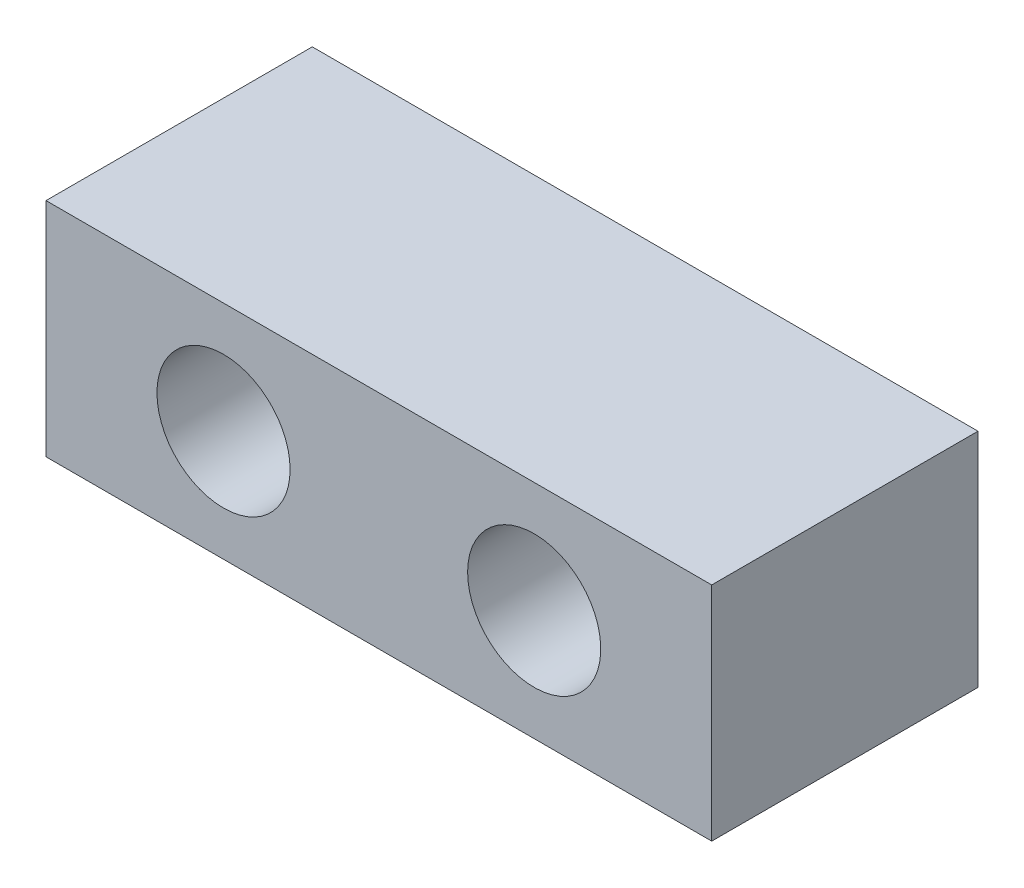
ISO-10303-21;
HEADER;
FILE_DESCRIPTION(('STEP AP214'),'2;1');
FILE_NAME('part.step','',(''),(''),'','','');
FILE_SCHEMA(('AUTOMOTIVE_DESIGN { 1 0 10303 214 1 1 1 1 }'));
ENDSEC;
DATA;
#1=APPLICATION_CONTEXT('core data for automotive mechanical design processes');
#2=APPLICATION_PROTOCOL_DEFINITION('international standard','automotive_design',2000,#1);
#3=PRODUCT_CONTEXT('',#1,'mechanical');
#4=PRODUCT('Part','Part','',(#3));
#5=PRODUCT_RELATED_PRODUCT_CATEGORY('part','',(#4));
#6=PRODUCT_DEFINITION_FORMATION('','',#4);
#7=PRODUCT_DEFINITION_CONTEXT('part definition',#1,'design');
#8=PRODUCT_DEFINITION('design','',#6,#7);
#9=PRODUCT_DEFINITION_SHAPE('','',#8);
#10=(LENGTH_UNIT() NAMED_UNIT(*) SI_UNIT(.MILLI.,.METRE.));
#11=(NAMED_UNIT(*) PLANE_ANGLE_UNIT() SI_UNIT($,.RADIAN.));
#12=(NAMED_UNIT(*) SI_UNIT($,.STERADIAN.) SOLID_ANGLE_UNIT());
#13=UNCERTAINTY_MEASURE_WITH_UNIT(LENGTH_MEASURE(1.E-05),#10,'distance_accuracy_value','');
#14=(GEOMETRIC_REPRESENTATION_CONTEXT(3) GLOBAL_UNCERTAINTY_ASSIGNED_CONTEXT((#13)) GLOBAL_UNIT_ASSIGNED_CONTEXT((#10,
#11,#12)) REPRESENTATION_CONTEXT('',''));
#15=CARTESIAN_POINT('',(0.,0.,0.));
#16=DIRECTION('',(0.,0.,1.));
#17=DIRECTION('',(1.,0.,0.));
#18=AXIS2_PLACEMENT_3D('',#15,#16,#17);
#19=CARTESIAN_POINT('',(0.,0.,12.));
#20=DIRECTION('',(1.,0.,0.));
#21=DIRECTION('',(0.,0.,-1.));
#22=AXIS2_PLACEMENT_3D('',#19,#20,#21);
#23=PLANE('',#22);
#24=DIRECTION('',(0.,-1.,0.));
#25=VECTOR('',#24,1.);
#26=CARTESIAN_POINT('',(0.,0.,0.));
#27=LINE('',#26,#25);
#28=CARTESIAN_POINT('',(0.,10.,0.));
#29=VERTEX_POINT('',#28);
#30=CARTESIAN_POINT('',(0.,0.,0.));
#31=VERTEX_POINT('',#30);
#32=EDGE_CURVE('E96',#29,#31,#27,.T.);
#33=ORIENTED_EDGE('',*,*,#32,.T.);
#34=DIRECTION('',(0.,0.,-1.));
#35=VECTOR('',#34,1.);
#36=CARTESIAN_POINT('',(0.,0.,12.));
#37=LINE('',#36,#35);
#38=CARTESIAN_POINT('',(0.,0.,12.));
#39=VERTEX_POINT('',#38);
#40=EDGE_CURVE('E11',#39,#31,#37,.T.);
#41=ORIENTED_EDGE('',*,*,#40,.F.);
#42=DIRECTION('',(0.,-1.,0.));
#43=VECTOR('',#42,1.);
#44=CARTESIAN_POINT('',(0.,0.,12.));
#45=LINE('',#44,#43);
#46=CARTESIAN_POINT('',(0.,10.,12.));
#47=VERTEX_POINT('',#46);
#48=EDGE_CURVE('E84',#47,#39,#45,.T.);
#49=ORIENTED_EDGE('',*,*,#48,.F.);
#50=DIRECTION('',(0.,0.,-1.));
#51=VECTOR('',#50,1.);
#52=CARTESIAN_POINT('',(0.,10.,12.));
#53=LINE('',#52,#51);
#54=EDGE_CURVE('E92',#47,#29,#53,.T.);
#55=ORIENTED_EDGE('',*,*,#54,.T.);
#56=EDGE_LOOP('',(#33,#41,#49,#55));
#57=FACE_BOUND('',#56,.T.);
#58=ADVANCED_FACE('F33',(#57),#23,.F.);
#59=CARTESIAN_POINT('',(0.,0.,12.));
#60=DIRECTION('',(0.,1.,0.));
#61=DIRECTION('',(0.,0.,1.));
#62=AXIS2_PLACEMENT_3D('',#59,#60,#61);
#63=PLANE('',#62);
#64=DIRECTION('',(1.,0.,0.));
#65=VECTOR('',#64,1.);
#66=CARTESIAN_POINT('',(0.,0.,0.));
#67=LINE('',#66,#65);
#68=CARTESIAN_POINT('',(30.,0.,0.));
#69=VERTEX_POINT('',#68);
#70=EDGE_CURVE('E88',#31,#69,#67,.T.);
#71=ORIENTED_EDGE('',*,*,#70,.T.);
#72=DIRECTION('',(0.,0.,-1.));
#73=VECTOR('',#72,1.);
#74=CARTESIAN_POINT('',(30.,0.,12.));
#75=LINE('',#74,#73);
#76=CARTESIAN_POINT('',(30.,0.,12.));
#77=VERTEX_POINT('',#76);
#78=EDGE_CURVE('E41',#77,#69,#75,.T.);
#79=ORIENTED_EDGE('',*,*,#78,.F.);
#80=DIRECTION('',(1.,0.,0.));
#81=VECTOR('',#80,1.);
#82=CARTESIAN_POINT('',(0.,0.,12.));
#83=LINE('',#82,#81);
#84=EDGE_CURVE('E79',#39,#77,#83,.T.);
#85=ORIENTED_EDGE('',*,*,#84,.F.);
#86=ORIENTED_EDGE('',*,*,#40,.T.);
#87=EDGE_LOOP('',(#71,#79,#85,#86));
#88=FACE_BOUND('',#87,.T.);
#89=ADVANCED_FACE('F87',(#88),#63,.F.);
#90=CARTESIAN_POINT('',(30.,0.,12.));
#91=DIRECTION('',(-1.,0.,0.));
#92=DIRECTION('',(0.,0.,1.));
#93=AXIS2_PLACEMENT_3D('',#90,#91,#92);
#94=PLANE('',#93);
#95=DIRECTION('',(0.,1.,0.));
#96=VECTOR('',#95,1.);
#97=CARTESIAN_POINT('',(30.,0.,0.));
#98=LINE('',#97,#96);
#99=CARTESIAN_POINT('',(30.,10.,0.));
#100=VERTEX_POINT('',#99);
#101=EDGE_CURVE('E66',#69,#100,#98,.T.);
#102=ORIENTED_EDGE('',*,*,#101,.T.);
#103=DIRECTION('',(0.,0.,-1.));
#104=VECTOR('',#103,1.);
#105=CARTESIAN_POINT('',(30.,10.,12.));
#106=LINE('',#105,#104);
#107=CARTESIAN_POINT('',(30.,10.,12.));
#108=VERTEX_POINT('',#107);
#109=EDGE_CURVE('E89',#108,#100,#106,.T.);
#110=ORIENTED_EDGE('',*,*,#109,.F.);
#111=DIRECTION('',(0.,1.,0.));
#112=VECTOR('',#111,1.);
#113=CARTESIAN_POINT('',(30.,0.,12.));
#114=LINE('',#113,#112);
#115=EDGE_CURVE('E82',#77,#108,#114,.T.);
#116=ORIENTED_EDGE('',*,*,#115,.F.);
#117=ORIENTED_EDGE('',*,*,#78,.T.);
#118=EDGE_LOOP('',(#102,#110,#116,#117));
#119=FACE_BOUND('',#118,.T.);
#120=ADVANCED_FACE('F90',(#119),#94,.F.);
#121=CARTESIAN_POINT('',(0.,10.,12.));
#122=DIRECTION('',(0.,-1.,0.));
#123=DIRECTION('',(0.,0.,-1.));
#124=AXIS2_PLACEMENT_3D('',#121,#122,#123);
#125=PLANE('',#124);
#126=DIRECTION('',(-1.,0.,0.));
#127=VECTOR('',#126,1.);
#128=CARTESIAN_POINT('',(0.,10.,0.));
#129=LINE('',#128,#127);
#130=EDGE_CURVE('E72',#100,#29,#129,.T.);
#131=ORIENTED_EDGE('',*,*,#130,.T.);
#132=ORIENTED_EDGE('',*,*,#54,.F.);
#133=DIRECTION('',(-1.,0.,0.));
#134=VECTOR('',#133,1.);
#135=CARTESIAN_POINT('',(0.,10.,12.));
#136=LINE('',#135,#134);
#137=EDGE_CURVE('E49',#108,#47,#136,.T.);
#138=ORIENTED_EDGE('',*,*,#137,.F.);
#139=ORIENTED_EDGE('',*,*,#109,.T.);
#140=EDGE_LOOP('',(#131,#132,#138,#139));
#141=FACE_BOUND('',#140,.T.);
#142=ADVANCED_FACE('F104',(#141),#125,.F.);
#143=CARTESIAN_POINT('',(0.,0.,12.));
#144=DIRECTION('',(0.,0.,-1.));
#145=DIRECTION('',(-1.,0.,0.));
#146=AXIS2_PLACEMENT_3D('',#143,#144,#145);
#147=PLANE('',#146);
#148=CARTESIAN_POINT('',(22.,5.,12.));
#149=DIRECTION('',(0.,0.,-1.));
#150=DIRECTION('',(-1.,0.,0.));
#151=AXIS2_PLACEMENT_3D('',#148,#149,#150);
#152=CIRCLE('',#151,3.);
#153=CARTESIAN_POINT('',(19.,5.,12.));
#154=VERTEX_POINT('',#153);
#155=EDGE_CURVE('E115',#154,#154,#152,.T.);
#156=ORIENTED_EDGE('',*,*,#155,.T.);
#157=EDGE_LOOP('',(#156));
#158=FACE_BOUND('',#157,.T.);
#159=CARTESIAN_POINT('',(8.,5.,12.));
#160=DIRECTION('',(0.,0.,-1.));
#161=DIRECTION('',(-1.,0.,0.));
#162=AXIS2_PLACEMENT_3D('',#159,#160,#161);
#163=CIRCLE('',#162,3.);
#164=CARTESIAN_POINT('',(5.,5.,12.));
#165=VERTEX_POINT('',#164);
#166=EDGE_CURVE('E99',#165,#165,#163,.T.);
#167=ORIENTED_EDGE('',*,*,#166,.T.);
#168=EDGE_LOOP('',(#167));
#169=FACE_BOUND('',#168,.T.);
#170=ORIENTED_EDGE('',*,*,#48,.T.);
#171=ORIENTED_EDGE('',*,*,#84,.T.);
#172=ORIENTED_EDGE('',*,*,#115,.T.);
#173=ORIENTED_EDGE('',*,*,#137,.T.);
#174=EDGE_LOOP('',(#170,#171,#172,#173));
#175=FACE_BOUND('',#174,.T.);
#176=ADVANCED_FACE('F80',(#158,#169,#175),#147,.F.);
#177=CARTESIAN_POINT('',(0.,0.,0.));
#178=DIRECTION('',(0.,0.,-1.));
#179=DIRECTION('',(-1.,0.,0.));
#180=AXIS2_PLACEMENT_3D('',#177,#178,#179);
#181=PLANE('',#180);
#182=CARTESIAN_POINT('',(22.,5.,0.));
#183=DIRECTION('',(0.,0.,1.));
#184=DIRECTION('',(-1.,0.,0.));
#185=AXIS2_PLACEMENT_3D('',#182,#183,#184);
#186=CIRCLE('',#185,3.);
#187=CARTESIAN_POINT('',(19.,5.,0.));
#188=VERTEX_POINT('',#187);
#189=EDGE_CURVE('E118',#188,#188,#186,.T.);
#190=ORIENTED_EDGE('',*,*,#189,.T.);
#191=EDGE_LOOP('',(#190));
#192=FACE_BOUND('',#191,.T.);
#193=CARTESIAN_POINT('',(8.,5.,0.));
#194=DIRECTION('',(0.,0.,1.));
#195=DIRECTION('',(1.,0.,0.));
#196=AXIS2_PLACEMENT_3D('',#193,#194,#195);
#197=CIRCLE('',#196,3.);
#198=CARTESIAN_POINT('',(11.,5.,0.));
#199=VERTEX_POINT('',#198);
#200=EDGE_CURVE('E112',#199,#199,#197,.T.);
#201=ORIENTED_EDGE('',*,*,#200,.T.);
#202=EDGE_LOOP('',(#201));
#203=FACE_BOUND('',#202,.T.);
#204=ORIENTED_EDGE('',*,*,#32,.F.);
#205=ORIENTED_EDGE('',*,*,#130,.F.);
#206=ORIENTED_EDGE('',*,*,#101,.F.);
#207=ORIENTED_EDGE('',*,*,#70,.F.);
#208=EDGE_LOOP('',(#204,#205,#206,#207));
#209=FACE_BOUND('',#208,.T.);
#210=ADVANCED_FACE('F107',(#192,#203,#209),#181,.T.);
#211=CARTESIAN_POINT('',(8.,5.,0.));
#212=DIRECTION('',(0.,0.,1.));
#213=DIRECTION('',(1.,0.,0.));
#214=AXIS2_PLACEMENT_3D('',#211,#212,#213);
#215=CYLINDRICAL_SURFACE('',#214,3.);
#216=ORIENTED_EDGE('',*,*,#200,.F.);
#217=EDGE_LOOP('',(#216));
#218=FACE_BOUND('',#217,.T.);
#219=ORIENTED_EDGE('',*,*,#166,.F.);
#220=EDGE_LOOP('',(#219));
#221=FACE_BOUND('',#220,.T.);
#222=ADVANCED_FACE('F127',(#218,#221),#215,.F.);
#223=CARTESIAN_POINT('',(22.,5.,0.));
#224=DIRECTION('',(0.,0.,1.));
#225=DIRECTION('',(1.,0.,0.));
#226=AXIS2_PLACEMENT_3D('',#223,#224,#225);
#227=CYLINDRICAL_SURFACE('',#226,3.);
#228=ORIENTED_EDGE('',*,*,#189,.F.);
#229=EDGE_LOOP('',(#228));
#230=FACE_BOUND('',#229,.T.);
#231=ORIENTED_EDGE('',*,*,#155,.F.);
#232=EDGE_LOOP('',(#231));
#233=FACE_BOUND('',#232,.T.);
#234=ADVANCED_FACE('F124',(#230,#233),#227,.F.);
#235=CLOSED_SHELL('',(#58,#89,#120,#142,#176,#210,#222,#234));
#236=MANIFOLD_SOLID_BREP('B2',#235);
#237=ADVANCED_BREP_SHAPE_REPRESENTATION('',(#18,#236),#14);
#238=SHAPE_DEFINITION_REPRESENTATION(#9,#237);
ENDSEC;
END-ISO-10303-21;
